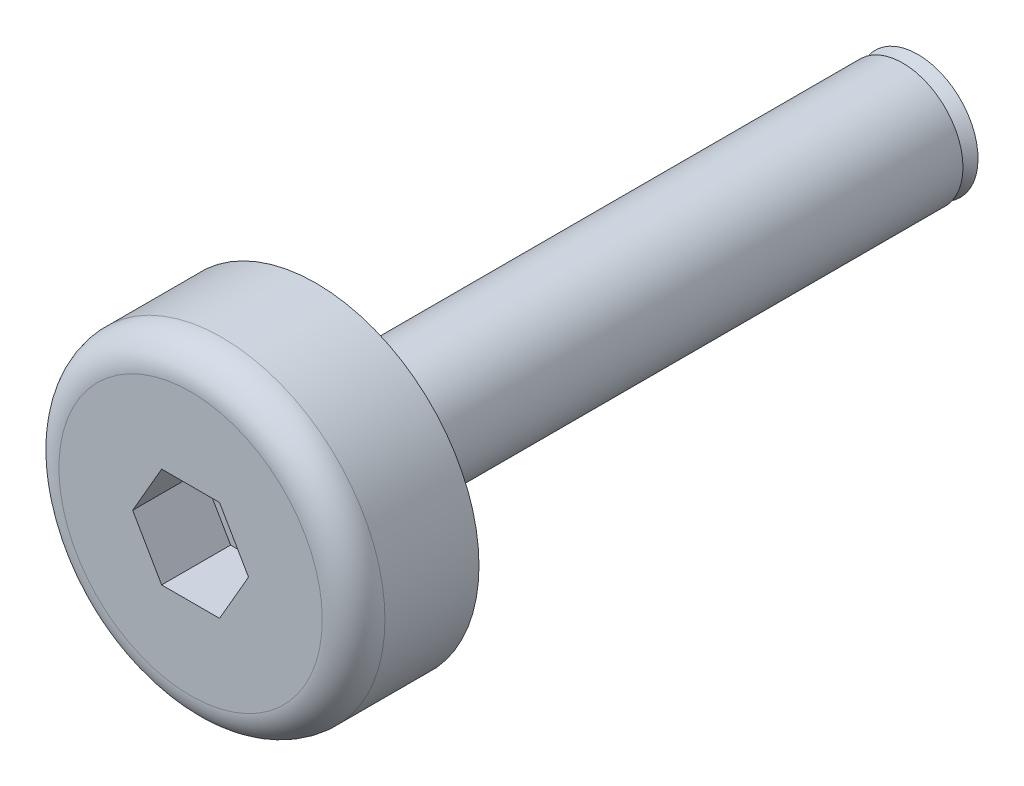
ISO-10303-21;
HEADER;
FILE_DESCRIPTION(('STEP AP214'),'2;1');
FILE_NAME('part.step','',(''),(''),'','','');
FILE_SCHEMA(('AUTOMOTIVE_DESIGN { 1 0 10303 214 1 1 1 1 }'));
ENDSEC;
DATA;
#1=APPLICATION_CONTEXT('core data for automotive mechanical design processes');
#2=APPLICATION_PROTOCOL_DEFINITION('international standard','automotive_design',2000,#1);
#3=PRODUCT_CONTEXT('',#1,'mechanical');
#4=PRODUCT('Part','Part','',(#3));
#5=PRODUCT_RELATED_PRODUCT_CATEGORY('part','',(#4));
#6=PRODUCT_DEFINITION_FORMATION('','',#4);
#7=PRODUCT_DEFINITION_CONTEXT('part definition',#1,'design');
#8=PRODUCT_DEFINITION('design','',#6,#7);
#9=PRODUCT_DEFINITION_SHAPE('','',#8);
#10=(LENGTH_UNIT() NAMED_UNIT(*) SI_UNIT(.MILLI.,.METRE.));
#11=(NAMED_UNIT(*) PLANE_ANGLE_UNIT() SI_UNIT($,.RADIAN.));
#12=(NAMED_UNIT(*) SI_UNIT($,.STERADIAN.) SOLID_ANGLE_UNIT());
#13=UNCERTAINTY_MEASURE_WITH_UNIT(LENGTH_MEASURE(1.E-05),#10,'distance_accuracy_value','');
#14=(GEOMETRIC_REPRESENTATION_CONTEXT(3) GLOBAL_UNCERTAINTY_ASSIGNED_CONTEXT((#13)) GLOBAL_UNIT_ASSIGNED_CONTEXT((#10,
#11,#12)) REPRESENTATION_CONTEXT('',''));
#15=CARTESIAN_POINT('',(0.,0.,0.));
#16=DIRECTION('',(0.,0.,1.));
#17=DIRECTION('',(1.,0.,0.));
#18=AXIS2_PLACEMENT_3D('',#15,#16,#17);
#19=CARTESIAN_POINT('',(0.,0.,2.5));
#20=DIRECTION('',(0.,0.,1.));
#21=DIRECTION('',(1.,0.,0.));
#22=AXIS2_PLACEMENT_3D('',#19,#20,#21);
#23=PLANE('',#22);
#24=CARTESIAN_POINT('',(0.,0.,2.5));
#25=DIRECTION('',(0.,0.,1.));
#26=DIRECTION('',(1.,0.,0.));
#27=AXIS2_PLACEMENT_3D('',#24,#25,#26);
#28=CIRCLE('',#27,2.625);
#29=CARTESIAN_POINT('',(2.625,0.,2.5));
#30=VERTEX_POINT('',#29);
#31=EDGE_CURVE('E142',#30,#30,#28,.T.);
#32=ORIENTED_EDGE('',*,*,#31,.T.);
#33=EDGE_LOOP('',(#32));
#34=FACE_BOUND('',#33,.T.);
#35=DIRECTION('',(0.5,-0.866025403784439,0.));
#36=VECTOR('',#35,1.);
#37=CARTESIAN_POINT('',(0.866025403784439,0.5,2.5));
#38=LINE('',#37,#36);
#39=CARTESIAN_POINT('',(0.577350269189626,1.,2.5));
#40=VERTEX_POINT('',#39);
#41=CARTESIAN_POINT('',(1.15470053837925,0.,2.5));
#42=VERTEX_POINT('',#41);
#43=EDGE_CURVE('E51',#40,#42,#38,.T.);
#44=ORIENTED_EDGE('',*,*,#43,.T.);
#45=DIRECTION('',(-0.5,-0.866025403784439,0.));
#46=VECTOR('',#45,1.);
#47=CARTESIAN_POINT('',(0.866025403784439,-0.5,2.5));
#48=LINE('',#47,#46);
#49=CARTESIAN_POINT('',(0.577350269189626,-1.,2.5));
#50=VERTEX_POINT('',#49);
#51=EDGE_CURVE('E11',#42,#50,#48,.T.);
#52=ORIENTED_EDGE('',*,*,#51,.T.);
#53=DIRECTION('',(-1.,0.,0.));
#54=VECTOR('',#53,1.);
#55=CARTESIAN_POINT('',(0.,-1.,2.5));
#56=LINE('',#55,#54);
#57=CARTESIAN_POINT('',(-0.577350269189626,-1.,2.5));
#58=VERTEX_POINT('',#57);
#59=EDGE_CURVE('E148',#50,#58,#56,.T.);
#60=ORIENTED_EDGE('',*,*,#59,.T.);
#61=DIRECTION('',(-0.5,0.866025403784439,0.));
#62=VECTOR('',#61,1.);
#63=CARTESIAN_POINT('',(-0.866025403784439,-0.5,2.5));
#64=LINE('',#63,#62);
#65=CARTESIAN_POINT('',(-1.15470053837925,0.,2.5));
#66=VERTEX_POINT('',#65);
#67=EDGE_CURVE('E151',#58,#66,#64,.T.);
#68=ORIENTED_EDGE('',*,*,#67,.T.);
#69=DIRECTION('',(0.5,0.866025403784439,0.));
#70=VECTOR('',#69,1.);
#71=CARTESIAN_POINT('',(-0.866025403784438,0.5,2.5));
#72=LINE('',#71,#70);
#73=CARTESIAN_POINT('',(-0.577350269189625,0.999999999999999,2.5));
#74=VERTEX_POINT('',#73);
#75=EDGE_CURVE('E154',#66,#74,#72,.T.);
#76=ORIENTED_EDGE('',*,*,#75,.T.);
#77=DIRECTION('',(1.,0.,0.));
#78=VECTOR('',#77,1.);
#79=CARTESIAN_POINT('',(0.,1.,2.5));
#80=LINE('',#79,#78);
#81=EDGE_CURVE('E157',#74,#40,#80,.T.);
#82=ORIENTED_EDGE('',*,*,#81,.T.);
#83=EDGE_LOOP('',(#44,#52,#60,#68,#76,#82));
#84=FACE_BOUND('',#83,.T.);
#85=ADVANCED_FACE('F43',(#34,#84),#23,.T.);
#86=CARTESIAN_POINT('',(0.,0.,2.5));
#87=DIRECTION('',(0.,0.,-1.));
#88=DIRECTION('',(-1.,0.,0.));
#89=AXIS2_PLACEMENT_3D('',#86,#87,#88);
#90=CYLINDRICAL_SURFACE('',#89,3.25);
#91=CARTESIAN_POINT('',(0.,0.,1.875));
#92=DIRECTION('',(0.,0.,1.));
#93=DIRECTION('',(1.,0.,0.));
#94=AXIS2_PLACEMENT_3D('',#91,#92,#93);
#95=CIRCLE('',#94,3.25);
#96=CARTESIAN_POINT('',(3.25,0.,1.875));
#97=VERTEX_POINT('',#96);
#98=EDGE_CURVE('E145',#97,#97,#95,.F.);
#99=ORIENTED_EDGE('',*,*,#98,.T.);
#100=EDGE_LOOP('',(#99));
#101=FACE_BOUND('',#100,.T.);
#102=CARTESIAN_POINT('',(0.,0.,0.));
#103=DIRECTION('',(0.,0.,1.));
#104=DIRECTION('',(1.,0.,0.));
#105=AXIS2_PLACEMENT_3D('',#102,#103,#104);
#106=CIRCLE('',#105,3.25);
#107=CARTESIAN_POINT('',(3.25,0.,0.));
#108=VERTEX_POINT('',#107);
#109=EDGE_CURVE('E100',#108,#108,#106,.T.);
#110=ORIENTED_EDGE('',*,*,#109,.T.);
#111=EDGE_LOOP('',(#110));
#112=FACE_BOUND('',#111,.T.);
#113=ADVANCED_FACE('F181',(#101,#112),#90,.T.);
#114=CARTESIAN_POINT('',(0.,0.,0.));
#115=DIRECTION('',(0.,0.,1.));
#116=DIRECTION('',(1.,0.,0.));
#117=AXIS2_PLACEMENT_3D('',#114,#115,#116);
#118=PLANE('',#117);
#119=CARTESIAN_POINT('',(0.,0.,0.));
#120=DIRECTION('',(0.,0.,1.));
#121=DIRECTION('',(1.,0.,0.));
#122=AXIS2_PLACEMENT_3D('',#119,#120,#121);
#123=CIRCLE('',#122,1.2);
#124=CARTESIAN_POINT('',(1.2,0.,0.));
#125=VERTEX_POINT('',#124);
#126=EDGE_CURVE('E119',#125,#125,#123,.T.);
#127=ORIENTED_EDGE('',*,*,#126,.T.);
#128=EDGE_LOOP('',(#127));
#129=FACE_BOUND('',#128,.T.);
#130=ORIENTED_EDGE('',*,*,#109,.F.);
#131=EDGE_LOOP('',(#130));
#132=FACE_BOUND('',#131,.T.);
#133=ADVANCED_FACE('F187',(#129,#132),#118,.F.);
#134=CARTESIAN_POINT('',(0.,0.,1.875));
#135=DIRECTION('',(0.,0.,1.));
#136=DIRECTION('',(1.,0.,0.));
#137=AXIS2_PLACEMENT_3D('',#134,#135,#136);
#138=TOROIDAL_SURFACE('',#137,2.625,0.625);
#139=ORIENTED_EDGE('',*,*,#98,.F.);
#140=EDGE_LOOP('',(#139));
#141=FACE_BOUND('',#140,.T.);
#142=ORIENTED_EDGE('',*,*,#31,.F.);
#143=EDGE_LOOP('',(#142));
#144=FACE_BOUND('',#143,.T.);
#145=ADVANCED_FACE('F45',(#141,#144),#138,.T.);
#146=CARTESIAN_POINT('',(0.577350269189626,-1.,2.51));
#147=DIRECTION('',(-0.866025403784439,0.5,0.));
#148=DIRECTION('',(-0.5,-0.866025403784439,0.));
#149=AXIS2_PLACEMENT_3D('',#146,#147,#148);
#150=PLANE('',#149);
#151=DIRECTION('',(0.,0.,-1.));
#152=VECTOR('',#151,1.);
#153=CARTESIAN_POINT('',(1.15470053837925,0.,2.51));
#154=LINE('',#153,#152);
#155=CARTESIAN_POINT('',(1.15470053837925,0.,1.125));
#156=VERTEX_POINT('',#155);
#157=EDGE_CURVE('E93',#42,#156,#154,.T.);
#158=ORIENTED_EDGE('',*,*,#157,.T.);
#159=DIRECTION('',(0.5,0.866025403784439,0.));
#160=VECTOR('',#159,1.);
#161=CARTESIAN_POINT('',(0.577350269189626,-1.,1.125));
#162=LINE('',#161,#160);
#163=CARTESIAN_POINT('',(0.577350269189626,-1.,1.125));
#164=VERTEX_POINT('',#163);
#165=EDGE_CURVE('E97',#164,#156,#162,.T.);
#166=ORIENTED_EDGE('',*,*,#165,.F.);
#167=DIRECTION('',(0.,0.,-1.));
#168=VECTOR('',#167,1.);
#169=CARTESIAN_POINT('',(0.577350269189626,-1.,2.51));
#170=LINE('',#169,#168);
#171=EDGE_CURVE('E132',#50,#164,#170,.T.);
#172=ORIENTED_EDGE('',*,*,#171,.F.);
#173=ORIENTED_EDGE('',*,*,#51,.F.);
#174=EDGE_LOOP('',(#158,#166,#172,#173));
#175=FACE_BOUND('',#174,.T.);
#176=ADVANCED_FACE('F95',(#175),#150,.T.);
#177=CARTESIAN_POINT('',(1.15470053837925,0.,2.51));
#178=DIRECTION('',(-0.866025403784439,-0.5,0.));
#179=DIRECTION('',(0.,0.,1.));
#180=AXIS2_PLACEMENT_3D('',#177,#178,#179);
#181=PLANE('',#180);
#182=DIRECTION('',(0.,0.,-1.));
#183=VECTOR('',#182,1.);
#184=CARTESIAN_POINT('',(0.577350269189626,1.,2.51));
#185=LINE('',#184,#183);
#186=CARTESIAN_POINT('',(0.577350269189626,1.,1.125));
#187=VERTEX_POINT('',#186);
#188=EDGE_CURVE('E101',#40,#187,#185,.T.);
#189=ORIENTED_EDGE('',*,*,#188,.T.);
#190=DIRECTION('',(-0.5,0.866025403784439,0.));
#191=VECTOR('',#190,1.);
#192=CARTESIAN_POINT('',(1.15470053837925,0.,1.125));
#193=LINE('',#192,#191);
#194=EDGE_CURVE('E104',#156,#187,#193,.T.);
#195=ORIENTED_EDGE('',*,*,#194,.F.);
#196=ORIENTED_EDGE('',*,*,#157,.F.);
#197=ORIENTED_EDGE('',*,*,#43,.F.);
#198=EDGE_LOOP('',(#189,#195,#196,#197));
#199=FACE_BOUND('',#198,.T.);
#200=ADVANCED_FACE('F105',(#199),#181,.T.);
#201=CARTESIAN_POINT('',(0.577350269189626,1.,2.51));
#202=DIRECTION('',(0.,-1.,0.));
#203=DIRECTION('',(1.,0.,0.));
#204=AXIS2_PLACEMENT_3D('',#201,#202,#203);
#205=PLANE('',#204);
#206=DIRECTION('',(0.,0.,-1.));
#207=VECTOR('',#206,1.);
#208=CARTESIAN_POINT('',(-0.577350269189625,0.999999999999999,2.51));
#209=LINE('',#208,#207);
#210=CARTESIAN_POINT('',(-0.577350269189625,0.999999999999999,1.125));
#211=VERTEX_POINT('',#210);
#212=EDGE_CURVE('E137',#74,#211,#209,.T.);
#213=ORIENTED_EDGE('',*,*,#212,.T.);
#214=DIRECTION('',(-1.,0.,0.));
#215=VECTOR('',#214,1.);
#216=CARTESIAN_POINT('',(0.577350269189626,1.,1.125));
#217=LINE('',#216,#215);
#218=EDGE_CURVE('E110',#187,#211,#217,.T.);
#219=ORIENTED_EDGE('',*,*,#218,.F.);
#220=ORIENTED_EDGE('',*,*,#188,.F.);
#221=ORIENTED_EDGE('',*,*,#81,.F.);
#222=EDGE_LOOP('',(#213,#219,#220,#221));
#223=FACE_BOUND('',#222,.T.);
#224=ADVANCED_FACE('F161',(#223),#205,.T.);
#225=CARTESIAN_POINT('',(-0.577350269189625,0.999999999999999,2.51));
#226=DIRECTION('',(0.866025403784439,-0.5,0.));
#227=DIRECTION('',(0.5,0.866025403784439,0.));
#228=AXIS2_PLACEMENT_3D('',#225,#226,#227);
#229=PLANE('',#228);
#230=DIRECTION('',(0.,0.,-1.));
#231=VECTOR('',#230,1.);
#232=CARTESIAN_POINT('',(-1.15470053837925,0.,2.51));
#233=LINE('',#232,#231);
#234=CARTESIAN_POINT('',(-1.15470053837925,0.,1.125));
#235=VERTEX_POINT('',#234);
#236=EDGE_CURVE('E135',#66,#235,#233,.T.);
#237=ORIENTED_EDGE('',*,*,#236,.T.);
#238=DIRECTION('',(-0.5,-0.866025403784439,0.));
#239=VECTOR('',#238,1.);
#240=CARTESIAN_POINT('',(-0.577350269189625,0.999999999999999,1.125));
#241=LINE('',#240,#239);
#242=EDGE_CURVE('E126',#211,#235,#241,.T.);
#243=ORIENTED_EDGE('',*,*,#242,.F.);
#244=ORIENTED_EDGE('',*,*,#212,.F.);
#245=ORIENTED_EDGE('',*,*,#75,.F.);
#246=EDGE_LOOP('',(#237,#243,#244,#245));
#247=FACE_BOUND('',#246,.T.);
#248=ADVANCED_FACE('F166',(#247),#229,.T.);
#249=CARTESIAN_POINT('',(-1.15470053837925,0.,2.51));
#250=DIRECTION('',(0.866025403784439,0.5,0.));
#251=DIRECTION('',(-0.5,0.866025403784439,0.));
#252=AXIS2_PLACEMENT_3D('',#249,#250,#251);
#253=PLANE('',#252);
#254=DIRECTION('',(0.,0.,-1.));
#255=VECTOR('',#254,1.);
#256=CARTESIAN_POINT('',(-0.577350269189626,-1.,2.51));
#257=LINE('',#256,#255);
#258=CARTESIAN_POINT('',(-0.577350269189626,-1.,1.125));
#259=VERTEX_POINT('',#258);
#260=EDGE_CURVE('E58',#58,#259,#257,.T.);
#261=ORIENTED_EDGE('',*,*,#260,.T.);
#262=DIRECTION('',(0.5,-0.866025403784439,0.));
#263=VECTOR('',#262,1.);
#264=CARTESIAN_POINT('',(-1.15470053837925,0.,1.125));
#265=LINE('',#264,#263);
#266=EDGE_CURVE('E129',#235,#259,#265,.T.);
#267=ORIENTED_EDGE('',*,*,#266,.F.);
#268=ORIENTED_EDGE('',*,*,#236,.F.);
#269=ORIENTED_EDGE('',*,*,#67,.F.);
#270=EDGE_LOOP('',(#261,#267,#268,#269));
#271=FACE_BOUND('',#270,.T.);
#272=ADVANCED_FACE('F169',(#271),#253,.T.);
#273=CARTESIAN_POINT('',(-0.577350269189626,-1.,2.51));
#274=DIRECTION('',(0.,1.,0.));
#275=DIRECTION('',(-1.,0.,0.));
#276=AXIS2_PLACEMENT_3D('',#273,#274,#275);
#277=PLANE('',#276);
#278=ORIENTED_EDGE('',*,*,#171,.T.);
#279=DIRECTION('',(1.,0.,0.));
#280=VECTOR('',#279,1.);
#281=CARTESIAN_POINT('',(-0.577350269189626,-1.,1.125));
#282=LINE('',#281,#280);
#283=EDGE_CURVE('E115',#259,#164,#282,.T.);
#284=ORIENTED_EDGE('',*,*,#283,.F.);
#285=ORIENTED_EDGE('',*,*,#260,.F.);
#286=ORIENTED_EDGE('',*,*,#59,.F.);
#287=EDGE_LOOP('',(#278,#284,#285,#286));
#288=FACE_BOUND('',#287,.T.);
#289=ADVANCED_FACE('F170',(#288),#277,.T.);
#290=CARTESIAN_POINT('',(1.15470053837925,0.,1.125));
#291=DIRECTION('',(0.,0.,1.));
#292=DIRECTION('',(-0.5,0.866025403784439,0.));
#293=AXIS2_PLACEMENT_3D('',#290,#291,#292);
#294=PLANE('',#293);
#295=ORIENTED_EDGE('',*,*,#165,.T.);
#296=ORIENTED_EDGE('',*,*,#194,.T.);
#297=ORIENTED_EDGE('',*,*,#218,.T.);
#298=ORIENTED_EDGE('',*,*,#242,.T.);
#299=ORIENTED_EDGE('',*,*,#266,.T.);
#300=ORIENTED_EDGE('',*,*,#283,.T.);
#301=EDGE_LOOP('',(#295,#296,#297,#298,#299,#300));
#302=FACE_BOUND('',#301,.T.);
#303=ADVANCED_FACE('F113',(#302),#294,.T.);
#304=CARTESIAN_POINT('',(0.,0.,0.));
#305=DIRECTION('',(0.,0.,-1.));
#306=DIRECTION('',(-1.,0.,0.));
#307=AXIS2_PLACEMENT_3D('',#304,#305,#306);
#308=CYLINDRICAL_SURFACE('',#307,1.2);
#309=ORIENTED_EDGE('',*,*,#126,.F.);
#310=EDGE_LOOP('',(#309));
#311=FACE_BOUND('',#310,.T.);
#312=CARTESIAN_POINT('',(0.,0.,-11.7));
#313=DIRECTION('',(0.,0.,1.));
#314=DIRECTION('',(1.,0.,0.));
#315=AXIS2_PLACEMENT_3D('',#312,#313,#314);
#316=CIRCLE('',#315,1.2);
#317=CARTESIAN_POINT('',(1.2,0.,-11.7));
#318=VERTEX_POINT('',#317);
#319=EDGE_CURVE('E122',#318,#318,#316,.T.);
#320=ORIENTED_EDGE('',*,*,#319,.T.);
#321=EDGE_LOOP('',(#320));
#322=FACE_BOUND('',#321,.T.);
#323=ADVANCED_FACE('F177',(#311,#322),#308,.T.);
#324=CARTESIAN_POINT('',(0.,0.,-11.7));
#325=DIRECTION('',(0.,0.,1.));
#326=DIRECTION('',(1.,0.,0.));
#327=AXIS2_PLACEMENT_3D('',#324,#325,#326);
#328=PLANE('',#327);
#329=CARTESIAN_POINT('',(0.,0.,-11.7));
#330=DIRECTION('',(0.,0.,-1.));
#331=DIRECTION('',(0.,1.,0.));
#332=AXIS2_PLACEMENT_3D('',#329,#330,#331);
#333=CIRCLE('',#332,0.9);
#334=CARTESIAN_POINT('',(0.,0.9,-11.7));
#335=VERTEX_POINT('',#334);
#336=EDGE_CURVE('E116',#335,#335,#333,.T.);
#337=ORIENTED_EDGE('',*,*,#336,.F.);
#338=EDGE_LOOP('',(#337));
#339=FACE_BOUND('',#338,.T.);
#340=ORIENTED_EDGE('',*,*,#319,.F.);
#341=EDGE_LOOP('',(#340));
#342=FACE_BOUND('',#341,.T.);
#343=ADVANCED_FACE('F219',(#339,#342),#328,.F.);
#344=CARTESIAN_POINT('',(0.,0.,-12.));
#345=DIRECTION('',(0.,0.,-1.));
#346=DIRECTION('',(0.,1.,0.));
#347=AXIS2_PLACEMENT_3D('',#344,#345,#346);
#348=PLANE('',#347);
#349=CARTESIAN_POINT('',(0.,0.,-12.));
#350=DIRECTION('',(0.,0.,-1.));
#351=DIRECTION('',(0.,1.,0.));
#352=AXIS2_PLACEMENT_3D('',#349,#350,#351);
#353=CIRCLE('',#352,1.2);
#354=CARTESIAN_POINT('',(0.,1.2,-12.));
#355=VERTEX_POINT('',#354);
#356=EDGE_CURVE('E205',#355,#355,#353,.T.);
#357=ORIENTED_EDGE('',*,*,#356,.T.);
#358=EDGE_LOOP('',(#357));
#359=FACE_BOUND('',#358,.T.);
#360=ADVANCED_FACE('F210',(#359),#348,.T.);
#361=CARTESIAN_POINT('',(0.,0.,-12.));
#362=DIRECTION('',(0.,0.,-1.));
#363=DIRECTION('',(0.,1.,0.));
#364=AXIS2_PLACEMENT_3D('',#361,#362,#363);
#365=CONICAL_SURFACE('',#364,1.2,0.785398163397457);
#366=ORIENTED_EDGE('',*,*,#336,.T.);
#367=EDGE_LOOP('',(#366));
#368=FACE_BOUND('',#367,.T.);
#369=ORIENTED_EDGE('',*,*,#356,.F.);
#370=EDGE_LOOP('',(#369));
#371=FACE_BOUND('',#370,.T.);
#372=ADVANCED_FACE('F212',(#368,#371),#365,.T.);
#373=CLOSED_SHELL('',(#85,#113,#133,#145,#176,#200,#224,#248,#272,#289,#303,#323,#343,#360,#372));
#374=MANIFOLD_SOLID_BREP('B2',#373);
#375=ADVANCED_BREP_SHAPE_REPRESENTATION('',(#18,#374),#14);
#376=SHAPE_DEFINITION_REPRESENTATION(#9,#375);
ENDSEC;
END-ISO-10303-21;
